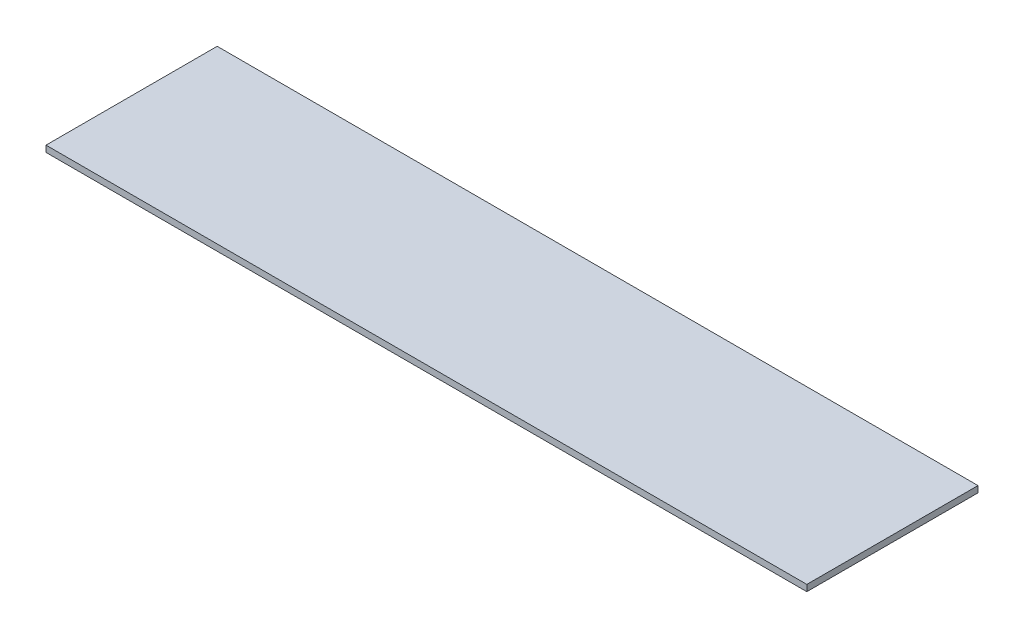
ISO-10303-21;
HEADER;
FILE_DESCRIPTION(('STEP AP214'),'2;1');
FILE_NAME('part.step','',(''),(''),'','','');
FILE_SCHEMA(('AUTOMOTIVE_DESIGN { 1 0 10303 214 1 1 1 1 }'));
ENDSEC;
DATA;
#1=APPLICATION_CONTEXT('core data for automotive mechanical design processes');
#2=APPLICATION_PROTOCOL_DEFINITION('international standard','automotive_design',2000,#1);
#3=PRODUCT_CONTEXT('',#1,'mechanical');
#4=PRODUCT('Part','Part','',(#3));
#5=PRODUCT_RELATED_PRODUCT_CATEGORY('part','',(#4));
#6=PRODUCT_DEFINITION_FORMATION('','',#4);
#7=PRODUCT_DEFINITION_CONTEXT('part definition',#1,'design');
#8=PRODUCT_DEFINITION('design','',#6,#7);
#9=PRODUCT_DEFINITION_SHAPE('','',#8);
#10=(LENGTH_UNIT() NAMED_UNIT(*) SI_UNIT(.MILLI.,.METRE.));
#11=(NAMED_UNIT(*) PLANE_ANGLE_UNIT() SI_UNIT($,.RADIAN.));
#12=(NAMED_UNIT(*) SI_UNIT($,.STERADIAN.) SOLID_ANGLE_UNIT());
#13=UNCERTAINTY_MEASURE_WITH_UNIT(LENGTH_MEASURE(1.E-05),#10,'distance_accuracy_value','');
#14=(GEOMETRIC_REPRESENTATION_CONTEXT(3) GLOBAL_UNCERTAINTY_ASSIGNED_CONTEXT((#13)) GLOBAL_UNIT_ASSIGNED_CONTEXT((#10,
#11,#12)) REPRESENTATION_CONTEXT('',''));
#15=CARTESIAN_POINT('',(0.,0.,0.));
#16=DIRECTION('',(0.,0.,1.));
#17=DIRECTION('',(1.,0.,0.));
#18=AXIS2_PLACEMENT_3D('',#15,#16,#17);
#19=CARTESIAN_POINT('',(0.,1.,0.));
#20=DIRECTION('',(1.,0.,0.));
#21=DIRECTION('',(0.,0.,-1.));
#22=AXIS2_PLACEMENT_3D('',#19,#20,#21);
#23=PLANE('',#22);
#24=DIRECTION('',(0.,0.,1.));
#25=VECTOR('',#24,1.);
#26=CARTESIAN_POINT('',(0.,0.,0.));
#27=LINE('',#26,#25);
#28=CARTESIAN_POINT('',(0.,0.,-27.));
#29=VERTEX_POINT('',#28);
#30=CARTESIAN_POINT('',(0.,0.,0.));
#31=VERTEX_POINT('',#30);
#32=EDGE_CURVE('E106',#29,#31,#27,.T.);
#33=ORIENTED_EDGE('',*,*,#32,.T.);
#34=DIRECTION('',(0.,-1.,0.));
#35=VECTOR('',#34,1.);
#36=CARTESIAN_POINT('',(0.,1.,0.));
#37=LINE('',#36,#35);
#38=CARTESIAN_POINT('',(0.,1.,0.));
#39=VERTEX_POINT('',#38);
#40=EDGE_CURVE('E11',#39,#31,#37,.T.);
#41=ORIENTED_EDGE('',*,*,#40,.F.);
#42=DIRECTION('',(0.,0.,1.));
#43=VECTOR('',#42,1.);
#44=CARTESIAN_POINT('',(0.,1.,0.));
#45=LINE('',#44,#43);
#46=CARTESIAN_POINT('',(0.,1.,-27.));
#47=VERTEX_POINT('',#46);
#48=EDGE_CURVE('E92',#47,#39,#45,.T.);
#49=ORIENTED_EDGE('',*,*,#48,.F.);
#50=DIRECTION('',(0.,-1.,0.));
#51=VECTOR('',#50,1.);
#52=CARTESIAN_POINT('',(0.,1.,-27.));
#53=LINE('',#52,#51);
#54=EDGE_CURVE('E105',#47,#29,#53,.T.);
#55=ORIENTED_EDGE('',*,*,#54,.T.);
#56=EDGE_LOOP('',(#33,#41,#49,#55));
#57=FACE_BOUND('',#56,.T.);
#58=ADVANCED_FACE('F43',(#57),#23,.F.);
#59=CARTESIAN_POINT('',(0.,1.,0.));
#60=DIRECTION('',(0.,0.,-1.));
#61=DIRECTION('',(-1.,0.,0.));
#62=AXIS2_PLACEMENT_3D('',#59,#60,#61);
#63=PLANE('',#62);
#64=DIRECTION('',(1.,0.,0.));
#65=VECTOR('',#64,1.);
#66=CARTESIAN_POINT('',(0.,0.,0.));
#67=LINE('',#66,#65);
#68=CARTESIAN_POINT('',(120.,0.,0.));
#69=VERTEX_POINT('',#68);
#70=EDGE_CURVE('E97',#31,#69,#67,.T.);
#71=ORIENTED_EDGE('',*,*,#70,.T.);
#72=DIRECTION('',(0.,-1.,0.));
#73=VECTOR('',#72,1.);
#74=CARTESIAN_POINT('',(120.,1.,0.));
#75=LINE('',#74,#73);
#76=CARTESIAN_POINT('',(120.,1.,0.));
#77=VERTEX_POINT('',#76);
#78=EDGE_CURVE('E51',#77,#69,#75,.T.);
#79=ORIENTED_EDGE('',*,*,#78,.F.);
#80=DIRECTION('',(1.,0.,0.));
#81=VECTOR('',#80,1.);
#82=CARTESIAN_POINT('',(0.,1.,0.));
#83=LINE('',#82,#81);
#84=EDGE_CURVE('E87',#39,#77,#83,.T.);
#85=ORIENTED_EDGE('',*,*,#84,.F.);
#86=ORIENTED_EDGE('',*,*,#40,.T.);
#87=EDGE_LOOP('',(#71,#79,#85,#86));
#88=FACE_BOUND('',#87,.T.);
#89=ADVANCED_FACE('F100',(#88),#63,.F.);
#90=CARTESIAN_POINT('',(120.,1.,0.));
#91=DIRECTION('',(-1.,0.,0.));
#92=DIRECTION('',(0.,0.,1.));
#93=AXIS2_PLACEMENT_3D('',#90,#91,#92);
#94=PLANE('',#93);
#95=DIRECTION('',(0.,0.,-1.));
#96=VECTOR('',#95,1.);
#97=CARTESIAN_POINT('',(120.,0.,0.));
#98=LINE('',#97,#96);
#99=CARTESIAN_POINT('',(120.,0.,-27.));
#100=VERTEX_POINT('',#99);
#101=EDGE_CURVE('E78',#69,#100,#98,.T.);
#102=ORIENTED_EDGE('',*,*,#101,.T.);
#103=DIRECTION('',(0.,-1.,0.));
#104=VECTOR('',#103,1.);
#105=CARTESIAN_POINT('',(120.,1.,-27.));
#106=LINE('',#105,#104);
#107=CARTESIAN_POINT('',(120.,1.,-27.));
#108=VERTEX_POINT('',#107);
#109=EDGE_CURVE('E98',#108,#100,#106,.T.);
#110=ORIENTED_EDGE('',*,*,#109,.F.);
#111=DIRECTION('',(0.,0.,-1.));
#112=VECTOR('',#111,1.);
#113=CARTESIAN_POINT('',(120.,1.,0.));
#114=LINE('',#113,#112);
#115=EDGE_CURVE('E95',#77,#108,#114,.T.);
#116=ORIENTED_EDGE('',*,*,#115,.F.);
#117=ORIENTED_EDGE('',*,*,#78,.T.);
#118=EDGE_LOOP('',(#102,#110,#116,#117));
#119=FACE_BOUND('',#118,.T.);
#120=ADVANCED_FACE('F99',(#119),#94,.F.);
#121=CARTESIAN_POINT('',(0.,1.,-27.));
#122=DIRECTION('',(0.,0.,1.));
#123=DIRECTION('',(1.,0.,0.));
#124=AXIS2_PLACEMENT_3D('',#121,#122,#123);
#125=PLANE('',#124);
#126=DIRECTION('',(-1.,0.,0.));
#127=VECTOR('',#126,1.);
#128=CARTESIAN_POINT('',(0.,0.,-27.));
#129=LINE('',#128,#127);
#130=EDGE_CURVE('E85',#100,#29,#129,.T.);
#131=ORIENTED_EDGE('',*,*,#130,.T.);
#132=ORIENTED_EDGE('',*,*,#54,.F.);
#133=DIRECTION('',(-1.,0.,0.));
#134=VECTOR('',#133,1.);
#135=CARTESIAN_POINT('',(0.,1.,-27.));
#136=LINE('',#135,#134);
#137=EDGE_CURVE('E56',#108,#47,#136,.T.);
#138=ORIENTED_EDGE('',*,*,#137,.F.);
#139=ORIENTED_EDGE('',*,*,#109,.T.);
#140=EDGE_LOOP('',(#131,#132,#138,#139));
#141=FACE_BOUND('',#140,.T.);
#142=ADVANCED_FACE('F111',(#141),#125,.F.);
#143=CARTESIAN_POINT('',(0.,1.,0.));
#144=DIRECTION('',(0.,-1.,0.));
#145=DIRECTION('',(0.,0.,-1.));
#146=AXIS2_PLACEMENT_3D('',#143,#144,#145);
#147=PLANE('',#146);
#148=ORIENTED_EDGE('',*,*,#48,.T.);
#149=ORIENTED_EDGE('',*,*,#84,.T.);
#150=ORIENTED_EDGE('',*,*,#115,.T.);
#151=ORIENTED_EDGE('',*,*,#137,.T.);
#152=EDGE_LOOP('',(#148,#149,#150,#151));
#153=FACE_BOUND('',#152,.T.);
#154=ADVANCED_FACE('F89',(#153),#147,.F.);
#155=CARTESIAN_POINT('',(0.,0.,0.));
#156=DIRECTION('',(0.,-1.,0.));
#157=DIRECTION('',(0.,0.,-1.));
#158=AXIS2_PLACEMENT_3D('',#155,#156,#157);
#159=PLANE('',#158);
#160=ORIENTED_EDGE('',*,*,#32,.F.);
#161=ORIENTED_EDGE('',*,*,#130,.F.);
#162=ORIENTED_EDGE('',*,*,#101,.F.);
#163=ORIENTED_EDGE('',*,*,#70,.F.);
#164=EDGE_LOOP('',(#160,#161,#162,#163));
#165=FACE_BOUND('',#164,.T.);
#166=ADVANCED_FACE('F116',(#165),#159,.T.);
#167=CLOSED_SHELL('',(#58,#89,#120,#142,#154,#166));
#168=MANIFOLD_SOLID_BREP('B2',#167);
#169=ADVANCED_BREP_SHAPE_REPRESENTATION('',(#18,#168),#14);
#170=SHAPE_DEFINITION_REPRESENTATION(#9,#169);
ENDSEC;
END-ISO-10303-21;
